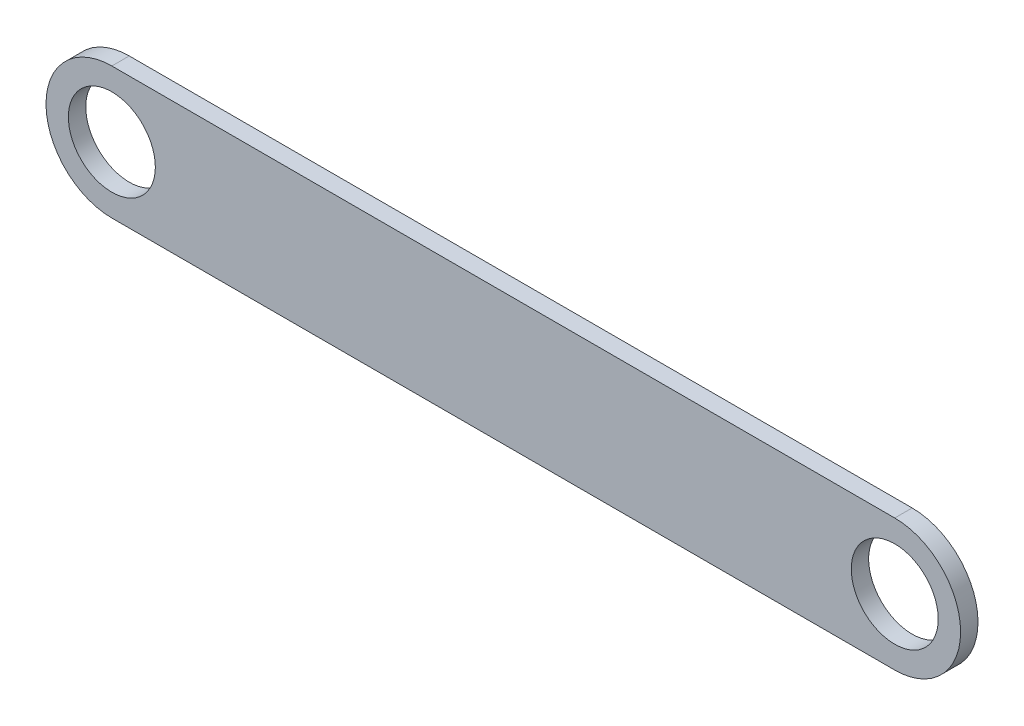
ISO-10303-21;
HEADER;
FILE_DESCRIPTION(('STEP AP214'),'2;1');
FILE_NAME('part.step','',(''),(''),'','','');
FILE_SCHEMA(('AUTOMOTIVE_DESIGN { 1 0 10303 214 1 1 1 1 }'));
ENDSEC;
DATA;
#1=APPLICATION_CONTEXT('core data for automotive mechanical design processes');
#2=APPLICATION_PROTOCOL_DEFINITION('international standard','automotive_design',2000,#1);
#3=PRODUCT_CONTEXT('',#1,'mechanical');
#4=PRODUCT('Part','Part','',(#3));
#5=PRODUCT_RELATED_PRODUCT_CATEGORY('part','',(#4));
#6=PRODUCT_DEFINITION_FORMATION('','',#4);
#7=PRODUCT_DEFINITION_CONTEXT('part definition',#1,'design');
#8=PRODUCT_DEFINITION('design','',#6,#7);
#9=PRODUCT_DEFINITION_SHAPE('','',#8);
#10=(LENGTH_UNIT() NAMED_UNIT(*) SI_UNIT(.MILLI.,.METRE.));
#11=(NAMED_UNIT(*) PLANE_ANGLE_UNIT() SI_UNIT($,.RADIAN.));
#12=(NAMED_UNIT(*) SI_UNIT($,.STERADIAN.) SOLID_ANGLE_UNIT());
#13=UNCERTAINTY_MEASURE_WITH_UNIT(LENGTH_MEASURE(1.E-05),#10,'distance_accuracy_value','');
#14=(GEOMETRIC_REPRESENTATION_CONTEXT(3) GLOBAL_UNCERTAINTY_ASSIGNED_CONTEXT((#13)) GLOBAL_UNIT_ASSIGNED_CONTEXT((#10,
#11,#12)) REPRESENTATION_CONTEXT('',''));
#15=CARTESIAN_POINT('',(0.,0.,0.));
#16=DIRECTION('',(0.,0.,1.));
#17=DIRECTION('',(1.,0.,0.));
#18=AXIS2_PLACEMENT_3D('',#15,#16,#17);
#19=CARTESIAN_POINT('',(-225.,0.,10.));
#20=DIRECTION('',(0.,0.,-1.));
#21=DIRECTION('',(-1.,0.,0.));
#22=AXIS2_PLACEMENT_3D('',#19,#20,#21);
#23=CYLINDRICAL_SURFACE('',#22,37.8504672897196);
#24=CARTESIAN_POINT('',(-225.,0.,0.));
#25=DIRECTION('',(0.,0.,1.));
#26=DIRECTION('',(1.,0.,0.));
#27=AXIS2_PLACEMENT_3D('',#24,#25,#26);
#28=CIRCLE('',#27,37.8504672897196);
#29=CARTESIAN_POINT('',(-225.,37.8504672897196,0.));
#30=VERTEX_POINT('',#29);
#31=CARTESIAN_POINT('',(-225.,-37.8504672897196,0.));
#32=VERTEX_POINT('',#31);
#33=EDGE_CURVE('E96',#30,#32,#28,.T.);
#34=ORIENTED_EDGE('',*,*,#33,.T.);
#35=DIRECTION('',(0.,0.,-1.));
#36=VECTOR('',#35,1.);
#37=CARTESIAN_POINT('',(-225.,-37.8504672897196,10.));
#38=LINE('',#37,#36);
#39=CARTESIAN_POINT('',(-225.,-37.8504672897196,10.));
#40=VERTEX_POINT('',#39);
#41=EDGE_CURVE('E11',#40,#32,#38,.T.);
#42=ORIENTED_EDGE('',*,*,#41,.F.);
#43=CARTESIAN_POINT('',(-225.,0.,10.));
#44=DIRECTION('',(0.,0.,1.));
#45=DIRECTION('',(1.,0.,0.));
#46=AXIS2_PLACEMENT_3D('',#43,#44,#45);
#47=CIRCLE('',#46,37.8504672897196);
#48=CARTESIAN_POINT('',(-225.,37.8504672897196,10.));
#49=VERTEX_POINT('',#48);
#50=EDGE_CURVE('E84',#49,#40,#47,.T.);
#51=ORIENTED_EDGE('',*,*,#50,.F.);
#52=DIRECTION('',(0.,0.,-1.));
#53=VECTOR('',#52,1.);
#54=CARTESIAN_POINT('',(-225.,37.8504672897196,10.));
#55=LINE('',#54,#53);
#56=EDGE_CURVE('E92',#49,#30,#55,.T.);
#57=ORIENTED_EDGE('',*,*,#56,.T.);
#58=EDGE_LOOP('',(#34,#42,#51,#57));
#59=FACE_BOUND('',#58,.T.);
#60=ADVANCED_FACE('F33',(#59),#23,.T.);
#61=CARTESIAN_POINT('',(-225.,-37.8504672897196,10.));
#62=DIRECTION('',(0.,1.,0.));
#63=DIRECTION('',(-1.,0.,0.));
#64=AXIS2_PLACEMENT_3D('',#61,#62,#63);
#65=PLANE('',#64);
#66=DIRECTION('',(1.,0.,0.));
#67=VECTOR('',#66,1.);
#68=CARTESIAN_POINT('',(-225.,-37.8504672897196,0.));
#69=LINE('',#68,#67);
#70=CARTESIAN_POINT('',(225.,-37.8504672897196,0.));
#71=VERTEX_POINT('',#70);
#72=EDGE_CURVE('E88',#32,#71,#69,.T.);
#73=ORIENTED_EDGE('',*,*,#72,.T.);
#74=DIRECTION('',(0.,0.,-1.));
#75=VECTOR('',#74,1.);
#76=CARTESIAN_POINT('',(225.,-37.8504672897196,10.));
#77=LINE('',#76,#75);
#78=CARTESIAN_POINT('',(225.,-37.8504672897196,10.));
#79=VERTEX_POINT('',#78);
#80=EDGE_CURVE('E41',#79,#71,#77,.T.);
#81=ORIENTED_EDGE('',*,*,#80,.F.);
#82=DIRECTION('',(1.,0.,0.));
#83=VECTOR('',#82,1.);
#84=CARTESIAN_POINT('',(-225.,-37.8504672897196,10.));
#85=LINE('',#84,#83);
#86=EDGE_CURVE('E79',#40,#79,#85,.T.);
#87=ORIENTED_EDGE('',*,*,#86,.F.);
#88=ORIENTED_EDGE('',*,*,#41,.T.);
#89=EDGE_LOOP('',(#73,#81,#87,#88));
#90=FACE_BOUND('',#89,.T.);
#91=ADVANCED_FACE('F87',(#90),#65,.F.);
#92=CARTESIAN_POINT('',(225.,0.,10.));
#93=DIRECTION('',(0.,0.,-1.));
#94=DIRECTION('',(-1.,0.,0.));
#95=AXIS2_PLACEMENT_3D('',#92,#93,#94);
#96=CYLINDRICAL_SURFACE('',#95,37.8504672897196);
#97=CARTESIAN_POINT('',(225.,0.,0.));
#98=DIRECTION('',(0.,0.,1.));
#99=DIRECTION('',(1.,0.,0.));
#100=AXIS2_PLACEMENT_3D('',#97,#98,#99);
#101=CIRCLE('',#100,37.8504672897196);
#102=CARTESIAN_POINT('',(225.,37.8504672897197,0.));
#103=VERTEX_POINT('',#102);
#104=EDGE_CURVE('E66',#71,#103,#101,.T.);
#105=ORIENTED_EDGE('',*,*,#104,.T.);
#106=DIRECTION('',(0.,0.,-1.));
#107=VECTOR('',#106,1.);
#108=CARTESIAN_POINT('',(225.,37.8504672897197,10.));
#109=LINE('',#108,#107);
#110=CARTESIAN_POINT('',(225.,37.8504672897197,10.));
#111=VERTEX_POINT('',#110);
#112=EDGE_CURVE('E89',#111,#103,#109,.T.);
#113=ORIENTED_EDGE('',*,*,#112,.F.);
#114=CARTESIAN_POINT('',(225.,0.,10.));
#115=DIRECTION('',(0.,0.,1.));
#116=DIRECTION('',(1.,0.,0.));
#117=AXIS2_PLACEMENT_3D('',#114,#115,#116);
#118=CIRCLE('',#117,37.8504672897196);
#119=EDGE_CURVE('E82',#79,#111,#118,.T.);
#120=ORIENTED_EDGE('',*,*,#119,.F.);
#121=ORIENTED_EDGE('',*,*,#80,.T.);
#122=EDGE_LOOP('',(#105,#113,#120,#121));
#123=FACE_BOUND('',#122,.T.);
#124=ADVANCED_FACE('F90',(#123),#96,.T.);
#125=CARTESIAN_POINT('',(-225.,37.8504672897196,10.));
#126=DIRECTION('',(0.,-1.,0.));
#127=DIRECTION('',(1.,0.,0.));
#128=AXIS2_PLACEMENT_3D('',#125,#126,#127);
#129=PLANE('',#128);
#130=DIRECTION('',(-1.,0.,0.));
#131=VECTOR('',#130,1.);
#132=CARTESIAN_POINT('',(-225.,37.8504672897196,0.));
#133=LINE('',#132,#131);
#134=EDGE_CURVE('E72',#103,#30,#133,.T.);
#135=ORIENTED_EDGE('',*,*,#134,.T.);
#136=ORIENTED_EDGE('',*,*,#56,.F.);
#137=DIRECTION('',(-1.,0.,0.));
#138=VECTOR('',#137,1.);
#139=CARTESIAN_POINT('',(-225.,37.8504672897196,10.));
#140=LINE('',#139,#138);
#141=EDGE_CURVE('E49',#111,#49,#140,.T.);
#142=ORIENTED_EDGE('',*,*,#141,.F.);
#143=ORIENTED_EDGE('',*,*,#112,.T.);
#144=EDGE_LOOP('',(#135,#136,#142,#143));
#145=FACE_BOUND('',#144,.T.);
#146=ADVANCED_FACE('F104',(#145),#129,.F.);
#147=CARTESIAN_POINT('',(-225.,0.,10.));
#148=DIRECTION('',(0.,0.,1.));
#149=DIRECTION('',(1.,0.,0.));
#150=AXIS2_PLACEMENT_3D('',#147,#148,#149);
#151=PLANE('',#150);
#152=CARTESIAN_POINT('',(-225.,0.,10.));
#153=DIRECTION('',(0.,0.,1.));
#154=DIRECTION('',(1.,0.,0.));
#155=AXIS2_PLACEMENT_3D('',#152,#153,#154);
#156=CIRCLE('',#155,25.);
#157=CARTESIAN_POINT('',(-200.,0.,10.));
#158=VERTEX_POINT('',#157);
#159=EDGE_CURVE('E116',#158,#158,#156,.T.);
#160=ORIENTED_EDGE('',*,*,#159,.F.);
#161=EDGE_LOOP('',(#160));
#162=FACE_BOUND('',#161,.T.);
#163=CARTESIAN_POINT('',(225.,0.,10.));
#164=DIRECTION('',(0.,0.,1.));
#165=DIRECTION('',(1.,0.,0.));
#166=AXIS2_PLACEMENT_3D('',#163,#164,#165);
#167=CIRCLE('',#166,25.);
#168=CARTESIAN_POINT('',(250.,0.,10.));
#169=VERTEX_POINT('',#168);
#170=EDGE_CURVE('E110',#169,#169,#167,.T.);
#171=ORIENTED_EDGE('',*,*,#170,.F.);
#172=EDGE_LOOP('',(#171));
#173=FACE_BOUND('',#172,.T.);
#174=ORIENTED_EDGE('',*,*,#50,.T.);
#175=ORIENTED_EDGE('',*,*,#86,.T.);
#176=ORIENTED_EDGE('',*,*,#119,.T.);
#177=ORIENTED_EDGE('',*,*,#141,.T.);
#178=EDGE_LOOP('',(#174,#175,#176,#177));
#179=FACE_BOUND('',#178,.T.);
#180=ADVANCED_FACE('F80',(#162,#173,#179),#151,.T.);
#181=CARTESIAN_POINT('',(-225.,0.,0.));
#182=DIRECTION('',(0.,0.,1.));
#183=DIRECTION('',(1.,0.,0.));
#184=AXIS2_PLACEMENT_3D('',#181,#182,#183);
#185=PLANE('',#184);
#186=CARTESIAN_POINT('',(-225.,0.,0.));
#187=DIRECTION('',(0.,0.,1.));
#188=DIRECTION('',(1.,0.,0.));
#189=AXIS2_PLACEMENT_3D('',#186,#187,#188);
#190=CIRCLE('',#189,25.);
#191=CARTESIAN_POINT('',(-200.,0.,0.));
#192=VERTEX_POINT('',#191);
#193=EDGE_CURVE('E99',#192,#192,#190,.T.);
#194=ORIENTED_EDGE('',*,*,#193,.T.);
#195=EDGE_LOOP('',(#194));
#196=FACE_BOUND('',#195,.T.);
#197=CARTESIAN_POINT('',(225.,0.,0.));
#198=DIRECTION('',(0.,0.,1.));
#199=DIRECTION('',(1.,0.,0.));
#200=AXIS2_PLACEMENT_3D('',#197,#198,#199);
#201=CIRCLE('',#200,25.);
#202=CARTESIAN_POINT('',(250.,0.,0.));
#203=VERTEX_POINT('',#202);
#204=EDGE_CURVE('E113',#203,#203,#201,.T.);
#205=ORIENTED_EDGE('',*,*,#204,.T.);
#206=EDGE_LOOP('',(#205));
#207=FACE_BOUND('',#206,.T.);
#208=ORIENTED_EDGE('',*,*,#33,.F.);
#209=ORIENTED_EDGE('',*,*,#134,.F.);
#210=ORIENTED_EDGE('',*,*,#104,.F.);
#211=ORIENTED_EDGE('',*,*,#72,.F.);
#212=EDGE_LOOP('',(#208,#209,#210,#211));
#213=FACE_BOUND('',#212,.T.);
#214=ADVANCED_FACE('F107',(#196,#207,#213),#185,.F.);
#215=CARTESIAN_POINT('',(225.,0.,0.));
#216=DIRECTION('',(0.,0.,1.));
#217=DIRECTION('',(1.,0.,0.));
#218=AXIS2_PLACEMENT_3D('',#215,#216,#217);
#219=CYLINDRICAL_SURFACE('',#218,25.);
#220=ORIENTED_EDGE('',*,*,#204,.F.);
#221=EDGE_LOOP('',(#220));
#222=FACE_BOUND('',#221,.T.);
#223=ORIENTED_EDGE('',*,*,#170,.T.);
#224=EDGE_LOOP('',(#223));
#225=FACE_BOUND('',#224,.T.);
#226=ADVANCED_FACE('F127',(#222,#225),#219,.F.);
#227=CARTESIAN_POINT('',(-225.,0.,0.));
#228=DIRECTION('',(0.,0.,1.));
#229=DIRECTION('',(1.,0.,0.));
#230=AXIS2_PLACEMENT_3D('',#227,#228,#229);
#231=CYLINDRICAL_SURFACE('',#230,25.);
#232=ORIENTED_EDGE('',*,*,#193,.F.);
#233=EDGE_LOOP('',(#232));
#234=FACE_BOUND('',#233,.T.);
#235=ORIENTED_EDGE('',*,*,#159,.T.);
#236=EDGE_LOOP('',(#235));
#237=FACE_BOUND('',#236,.T.);
#238=ADVANCED_FACE('F124',(#234,#237),#231,.F.);
#239=CLOSED_SHELL('',(#60,#91,#124,#146,#180,#214,#226,#238));
#240=MANIFOLD_SOLID_BREP('B2',#239);
#241=ADVANCED_BREP_SHAPE_REPRESENTATION('',(#18,#240),#14);
#242=SHAPE_DEFINITION_REPRESENTATION(#9,#241);
ENDSEC;
END-ISO-10303-21;
